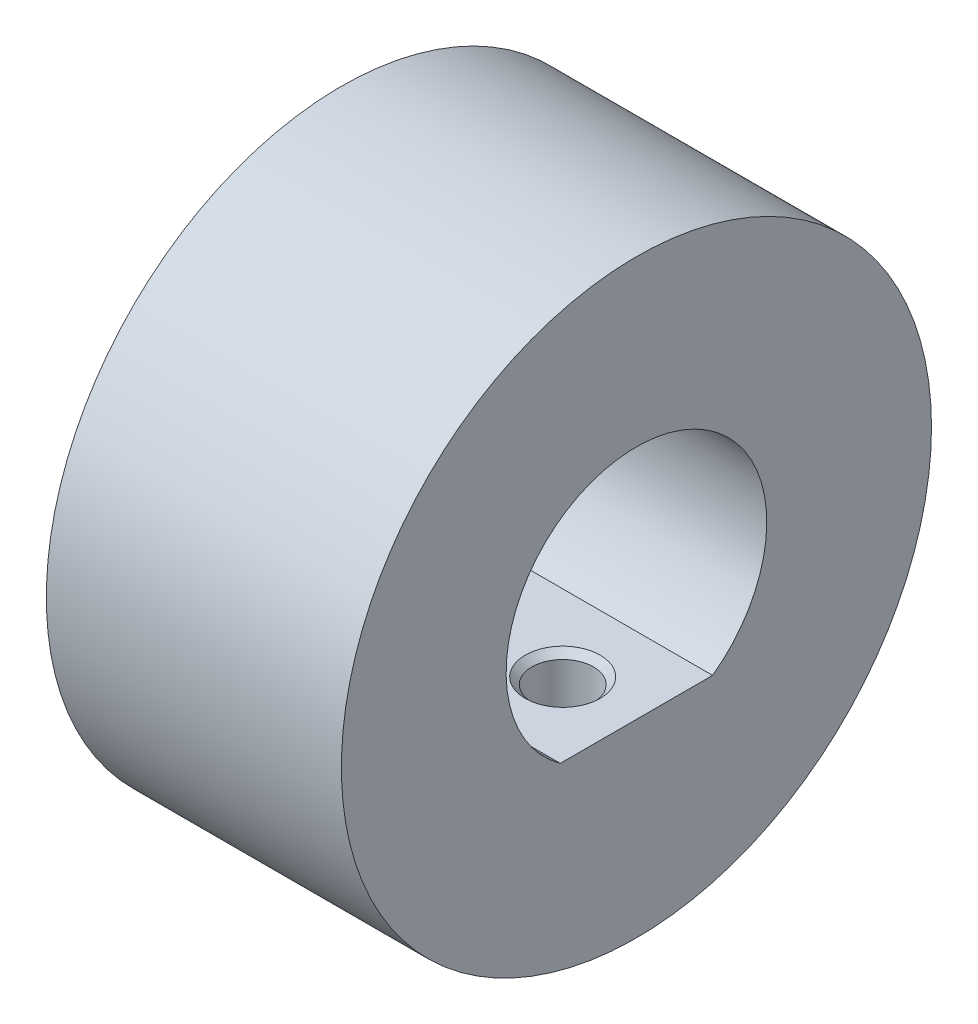
ISO-10303-21;
HEADER;
FILE_DESCRIPTION(('STEP AP214'),'2;1');
FILE_NAME('part.step','',(''),(''),'','','');
FILE_SCHEMA(('AUTOMOTIVE_DESIGN { 1 0 10303 214 1 1 1 1 }'));
ENDSEC;
DATA;
#1=APPLICATION_CONTEXT('core data for automotive mechanical design processes');
#2=APPLICATION_PROTOCOL_DEFINITION('international standard','automotive_design',2000,#1);
#3=PRODUCT_CONTEXT('',#1,'mechanical');
#4=PRODUCT('Part','Part','',(#3));
#5=PRODUCT_RELATED_PRODUCT_CATEGORY('part','',(#4));
#6=PRODUCT_DEFINITION_FORMATION('','',#4);
#7=PRODUCT_DEFINITION_CONTEXT('part definition',#1,'design');
#8=PRODUCT_DEFINITION('design','',#6,#7);
#9=PRODUCT_DEFINITION_SHAPE('','',#8);
#10=(LENGTH_UNIT() NAMED_UNIT(*) SI_UNIT(.MILLI.,.METRE.));
#11=(NAMED_UNIT(*) PLANE_ANGLE_UNIT() SI_UNIT($,.RADIAN.));
#12=(NAMED_UNIT(*) SI_UNIT($,.STERADIAN.) SOLID_ANGLE_UNIT());
#13=UNCERTAINTY_MEASURE_WITH_UNIT(LENGTH_MEASURE(1.E-05),#10,'distance_accuracy_value','');
#14=(GEOMETRIC_REPRESENTATION_CONTEXT(3) GLOBAL_UNCERTAINTY_ASSIGNED_CONTEXT((#13)) GLOBAL_UNIT_ASSIGNED_CONTEXT((#10,
#11,#12)) REPRESENTATION_CONTEXT('',''));
#15=CARTESIAN_POINT('',(0.,0.,0.));
#16=DIRECTION('',(0.,0.,1.));
#17=DIRECTION('',(1.,0.,0.));
#18=AXIS2_PLACEMENT_3D('',#15,#16,#17);
#19=CARTESIAN_POINT('',(21.41105965838,107.1240091412,98.74151472549));
#20=DIRECTION('',(-1.,0.,0.));
#21=DIRECTION('',(0.,0.,1.));
#22=AXIS2_PLACEMENT_3D('',#19,#20,#21);
#23=CONICAL_SURFACE('',#22,0.,1.02974425868897);
#24=CARTESIAN_POINT('',(21.41105965838,107.1240091412,98.74151472549));
#25=VERTEX_POINT('',#24);
#26=VERTEX_LOOP('',#25);
#27=FACE_BOUND('',#26,.T.);
#28=CARTESIAN_POINT('',(20.65998388459,107.1240091412,98.74151472549));
#29=DIRECTION('',(-1.,0.,0.));
#30=DIRECTION('',(0.,1.,0.));
#31=AXIS2_PLACEMENT_3D('',#28,#29,#30);
#32=CIRCLE('',#31,1.24999999999999);
#33=CARTESIAN_POINT('',(20.65998388459,108.3740091412,98.74151472549));
#34=VERTEX_POINT('',#33);
#35=EDGE_CURVE('E70',#34,#34,#32,.F.);
#36=ORIENTED_EDGE('',*,*,#35,.F.);
#37=EDGE_LOOP('',(#36));
#38=FACE_BOUND('',#37,.T.);
#39=ADVANCED_FACE('F16',(#27,#38),#23,.F.);
#40=CARTESIAN_POINT('',(21.41105965838,114.6190517522,91.51416149256));
#41=DIRECTION('',(-1.,0.,0.));
#42=DIRECTION('',(0.,0.,1.));
#43=AXIS2_PLACEMENT_3D('',#40,#41,#42);
#44=CONICAL_SURFACE('',#43,0.,1.02974425868897);
#45=CARTESIAN_POINT('',(21.41105965838,114.6190517522,91.51416149256));
#46=VERTEX_POINT('',#45);
#47=VERTEX_LOOP('',#46);
#48=FACE_BOUND('',#47,.T.);
#49=CARTESIAN_POINT('',(20.65998388459,114.6190517522,91.51416149256));
#50=DIRECTION('',(-1.,0.,0.));
#51=DIRECTION('',(0.,1.,0.));
#52=AXIS2_PLACEMENT_3D('',#49,#50,#51);
#53=CIRCLE('',#52,1.24999999999999);
#54=CARTESIAN_POINT('',(20.65998388459,115.8690517522,91.51416149256));
#55=VERTEX_POINT('',#54);
#56=EDGE_CURVE('E73',#55,#55,#53,.F.);
#57=ORIENTED_EDGE('',*,*,#56,.F.);
#58=EDGE_LOOP('',(#57));
#59=FACE_BOUND('',#58,.T.);
#60=ADVANCED_FACE('F66',(#48,#59),#44,.F.);
#61=CARTESIAN_POINT('',(21.41105965838,107.1240091412,83.74151472549));
#62=DIRECTION('',(-1.,0.,0.));
#63=DIRECTION('',(0.,0.,1.));
#64=AXIS2_PLACEMENT_3D('',#61,#62,#63);
#65=CONICAL_SURFACE('',#64,0.,1.02974425868897);
#66=CARTESIAN_POINT('',(21.41105965838,107.1240091412,83.74151472549));
#67=VERTEX_POINT('',#66);
#68=VERTEX_LOOP('',#67);
#69=FACE_BOUND('',#68,.T.);
#70=CARTESIAN_POINT('',(20.65998388459,107.1240091412,83.74151472549));
#71=DIRECTION('',(-1.,0.,0.));
#72=DIRECTION('',(0.,1.,0.));
#73=AXIS2_PLACEMENT_3D('',#70,#71,#72);
#74=CIRCLE('',#73,1.24999999999999);
#75=CARTESIAN_POINT('',(20.65998388459,108.3740091412,83.74151472549));
#76=VERTEX_POINT('',#75);
#77=EDGE_CURVE('E80',#76,#76,#74,.F.);
#78=ORIENTED_EDGE('',*,*,#77,.F.);
#79=EDGE_LOOP('',(#78));
#80=FACE_BOUND('',#79,.T.);
#81=ADVANCED_FACE('F200',(#69,#80),#65,.F.);
#82=CARTESIAN_POINT('',(20.65998388459,107.1240091412,98.74151472549));
#83=DIRECTION('',(-1.,0.,0.));
#84=DIRECTION('',(0.,0.,1.));
#85=AXIS2_PLACEMENT_3D('',#82,#83,#84);
#86=CYLINDRICAL_SURFACE('',#85,1.25);
#87=CARTESIAN_POINT('',(12.4349838845914,107.1240091412,98.74151472549));
#88=DIRECTION('',(-1.,0.,0.));
#89=DIRECTION('',(0.,1.,0.));
#90=AXIS2_PLACEMENT_3D('',#87,#88,#89);
#91=CIRCLE('',#90,1.25000000007321);
#92=CARTESIAN_POINT('',(12.4349838845914,108.374009141273,98.74151472549));
#93=VERTEX_POINT('',#92);
#94=EDGE_CURVE('E192',#93,#93,#91,.F.);
#95=ORIENTED_EDGE('',*,*,#94,.F.);
#96=EDGE_LOOP('',(#95));
#97=FACE_BOUND('',#96,.T.);
#98=ORIENTED_EDGE('',*,*,#35,.T.);
#99=EDGE_LOOP('',(#98));
#100=FACE_BOUND('',#99,.T.);
#101=ADVANCED_FACE('F202',(#97,#100),#86,.F.);
#102=CARTESIAN_POINT('',(20.65998388459,114.6190517522,91.51416149256));
#103=DIRECTION('',(-1.,0.,0.));
#104=DIRECTION('',(0.,0.,1.));
#105=AXIS2_PLACEMENT_3D('',#102,#103,#104);
#106=CYLINDRICAL_SURFACE('',#105,1.24999999999999);
#107=CARTESIAN_POINT('',(12.4349838845914,114.6190517522,91.51416149256));
#108=DIRECTION('',(-1.,0.,0.));
#109=DIRECTION('',(0.,1.,0.));
#110=AXIS2_PLACEMENT_3D('',#107,#108,#109);
#111=CIRCLE('',#110,1.24999999998229);
#112=CARTESIAN_POINT('',(12.4349838845914,115.869051752182,91.51416149256));
#113=VERTEX_POINT('',#112);
#114=EDGE_CURVE('E188',#113,#113,#111,.F.);
#115=ORIENTED_EDGE('',*,*,#114,.F.);
#116=EDGE_LOOP('',(#115));
#117=FACE_BOUND('',#116,.T.);
#118=ORIENTED_EDGE('',*,*,#56,.T.);
#119=EDGE_LOOP('',(#118));
#120=FACE_BOUND('',#119,.T.);
#121=ADVANCED_FACE('F207',(#117,#120),#106,.F.);
#122=CARTESIAN_POINT('',(20.65998388459,107.1240091412,83.74151472549));
#123=DIRECTION('',(-1.,0.,0.));
#124=DIRECTION('',(0.,0.,1.));
#125=AXIS2_PLACEMENT_3D('',#122,#123,#124);
#126=CYLINDRICAL_SURFACE('',#125,1.25);
#127=CARTESIAN_POINT('',(12.4349838845914,107.1240091412,83.74151472549));
#128=DIRECTION('',(-1.,0.,0.));
#129=DIRECTION('',(0.,1.,0.));
#130=AXIS2_PLACEMENT_3D('',#127,#128,#129);
#131=CIRCLE('',#130,1.25000000007321);
#132=CARTESIAN_POINT('',(12.4349838845914,108.374009141273,83.74151472549));
#133=VERTEX_POINT('',#132);
#134=EDGE_CURVE('E185',#133,#133,#131,.F.);
#135=ORIENTED_EDGE('',*,*,#134,.F.);
#136=EDGE_LOOP('',(#135));
#137=FACE_BOUND('',#136,.T.);
#138=ORIENTED_EDGE('',*,*,#77,.T.);
#139=EDGE_LOOP('',(#138));
#140=FACE_BOUND('',#139,.T.);
#141=ADVANCED_FACE('F149',(#137,#140),#126,.F.);
#142=CARTESIAN_POINT('',(12.15998388459,107.1240091412,91.24151472549));
#143=DIRECTION('',(1.,0.,0.));
#144=DIRECTION('',(0.,0.,-1.));
#145=AXIS2_PLACEMENT_3D('',#142,#143,#144);
#146=CYLINDRICAL_SURFACE('',#145,11.99999999996);
#147=CARTESIAN_POINT('',(13.90998388459,95.12400914124,91.2415149440293));
#148=CARTESIAN_POINT('',(13.9099868771111,95.1240099708754,91.1715046838228));
#149=CARTESIAN_POINT('',(13.9158853291396,95.1246283156418,91.1014490841306));
#150=CARTESIAN_POINT('',(13.9393256126678,95.1270355305798,90.9632816715167));
#151=CARTESIAN_POINT('',(13.9568800432397,95.1288256673243,90.8951720452007));
#152=CARTESIAN_POINT('',(14.0031151008883,95.1333744972015,90.7629154606143));
#153=CARTESIAN_POINT('',(14.0317891258246,95.1361326155132,90.6987661770827));
#154=CARTESIAN_POINT('',(14.0994349359428,95.1423091372306,90.5762065769242));
#155=CARTESIAN_POINT('',(14.1384043944056,95.1457273914017,90.5177949676966));
#156=CARTESIAN_POINT('',(14.2256930699479,95.1528560613593,90.4081309524338));
#157=CARTESIAN_POINT('',(14.2740433056393,95.1565674215029,90.3569032968082));
#158=CARTESIAN_POINT('',(14.3786693793685,95.1638571766945,90.2632626368071));
#159=CARTESIAN_POINT('',(14.4349473328647,95.1674355359291,90.2208519926952));
#160=CARTESIAN_POINT('',(14.5540009596617,95.1740645384081,90.145957431993));
#161=CARTESIAN_POINT('',(14.6167940305565,95.1771137073996,90.1135010598827));
#162=CARTESIAN_POINT('',(14.7469317554394,95.1823215544009,90.0596363400773));
#163=CARTESIAN_POINT('',(14.8142712618742,95.1844812204762,90.0382157271177));
#164=CARTESIAN_POINT('',(14.9283131354627,95.1871293660268,90.0122862183268));
#165=CARTESIAN_POINT('',(14.9742913501161,95.1879360315886,90.0045077179527));
#166=CARTESIAN_POINT('',(15.0668343146717,95.1890170688366,89.994120984191));
#167=CARTESIAN_POINT('',(15.1133990616928,95.1892914431365,89.9915127254153));
#168=CARTESIAN_POINT('',(15.2299929838874,95.1892900310988,89.9915177312636));
#169=CARTESIAN_POINT('',(15.3000474245496,95.1886682347059,89.9974160064895));
#170=CARTESIAN_POINT('',(15.4382124266851,95.1862486932552,90.0208554947713));
#171=CARTESIAN_POINT('',(15.5063208006626,95.1844496753133,90.0384093108142));
#172=CARTESIAN_POINT('',(15.6385747358017,95.1798815839907,90.0846425591975));
#173=CARTESIAN_POINT('',(15.7027226327746,95.1771130889434,90.1133153596957));
#174=CARTESIAN_POINT('',(15.8252799054927,95.1709188335472,90.180958281123));
#175=CARTESIAN_POINT('',(15.8836905721328,95.1674932215662,90.2199260783308));
#176=CARTESIAN_POINT('',(15.9933556261628,95.1603558900254,90.3072130838108));
#177=CARTESIAN_POINT('',(16.0445849672968,95.1566432359194,90.3555636841417));
#178=CARTESIAN_POINT('',(16.1382288795551,95.1493576815488,90.460191197091));
#179=CARTESIAN_POINT('',(16.1806410955724,95.1457848188296,90.5164702207217));
#180=CARTESIAN_POINT('',(16.2555372889438,95.1391713192963,90.6355247913496));
#181=CARTESIAN_POINT('',(16.2879940125714,95.1361321530479,90.6983175529867));
#182=CARTESIAN_POINT('',(16.3418594698281,95.1309442790815,90.8284546054125));
#183=CARTESIAN_POINT('',(16.3632804630368,95.1287945837765,90.8957937511217));
#184=CARTESIAN_POINT('',(16.3892110740728,95.1261593267742,91.0098366618714));
#185=CARTESIAN_POINT('',(16.3969900746961,95.1253568293126,91.0558163657439));
#186=CARTESIAN_POINT('',(16.4073774693265,95.1242814611489,91.1483623029848));
#187=CARTESIAN_POINT('',(16.4099858882485,95.1240085878948,91.194928533526));
#188=CARTESIAN_POINT('',(16.4099808734764,95.1240099728115,91.3115250995491));
#189=CARTESIAN_POINT('',(16.4040824027854,95.1246283195222,91.3815806979184));
#190=CARTESIAN_POINT('',(16.3806420823959,95.1270355381388,91.5197481046302));
#191=CARTESIAN_POINT('',(16.3630876336544,95.1288256766144,91.5878577263684));
#192=CARTESIAN_POINT('',(16.3168525406769,95.1333745095475,91.7201142988627));
#193=CARTESIAN_POINT('',(16.2881784985706,95.1361326291853,91.7842635748782));
#194=CARTESIAN_POINT('',(16.2205326555773,95.1423091530021,91.9068231572762));
#195=CARTESIAN_POINT('',(16.1815631814045,95.145727407947,91.9652347562575));
#196=CARTESIAN_POINT('',(16.0942744762685,95.1528560788146,92.0748987485264));
#197=CARTESIAN_POINT('',(16.0459242266969,95.1565674390921,92.1261263913937));
#198=CARTESIAN_POINT('',(15.9412981274557,95.1638571938891,92.2197670237324));
#199=CARTESIAN_POINT('',(15.8850201623249,95.1674355525949,92.262177652936));
#200=CARTESIAN_POINT('',(15.7659665150711,95.1740645533906,92.3370721818606));
#201=CARTESIAN_POINT('',(15.7031734353837,95.1771137212278,92.3695285371319));
#202=CARTESIAN_POINT('',(15.5730356959808,95.1823215654308,92.4233932219475));
#203=CARTESIAN_POINT('',(15.5056961838271,95.1844812298648,92.4448138167855));
#204=CARTESIAN_POINT('',(15.3916543579919,95.1871293711815,92.4707432824989));
#205=CARTESIAN_POINT('',(15.3456761972151,95.1879360348271,92.4785217642227));
#206=CARTESIAN_POINT('',(15.2531333425268,95.1890170694977,92.4889084730617));
#207=CARTESIAN_POINT('',(15.2065686514966,95.1892914431365,92.4915167255647));
#208=CARTESIAN_POINT('',(15.0899747854447,95.1892900310979,92.4915117197128));
#209=CARTESIAN_POINT('',(15.0199203448252,95.1886682347073,92.4856134445046));
#210=CARTESIAN_POINT('',(14.8817553426506,95.18624869326,92.4621739562541));
#211=CARTESIAN_POINT('',(14.8136469685966,95.1844496753162,92.4446201401952));
#212=CARTESIAN_POINT('',(14.6813930333611,95.1798815839899,92.3983868917747));
#213=CARTESIAN_POINT('',(14.6172451363646,95.1771130889416,92.3697140912655));
#214=CARTESIAN_POINT('',(14.4946878636479,95.1709188335449,92.3020711698315));
#215=CARTESIAN_POINT('',(14.4362771970289,95.1674932215651,92.2631033726346));
#216=CARTESIAN_POINT('',(14.3266121430354,95.1603558900266,92.1758163671837));
#217=CARTESIAN_POINT('',(14.2753828019168,95.1566432359218,92.1274657668709));
#218=CARTESIAN_POINT('',(14.1817388896522,95.1493576815511,92.0228382539244));
#219=CARTESIAN_POINT('',(14.139326673619,95.1457848188306,91.9665592302732));
#220=CARTESIAN_POINT('',(14.0644304801896,95.1391713192922,91.8475046595594));
#221=CARTESIAN_POINT('',(14.0319737565293,95.1361321530403,91.7847118978509));
#222=CARTESIAN_POINT('',(13.9781082992947,95.1309442790759,91.65457484538));
#223=CARTESIAN_POINT('',(13.9566873061129,95.128794583774,91.5872356997088));
#224=CARTESIAN_POINT('',(13.930756707371,95.1261593280201,91.4731928430557));
#225=CARTESIAN_POINT('',(13.9229777129723,95.1253568312187,91.4272131945171));
#226=CARTESIAN_POINT('',(13.912590318397,95.1242814630765,91.3346673686467));
#227=CARTESIAN_POINT('',(13.9099818933057,95.1240085891838,91.2881011941421));
#228=CARTESIAN_POINT('',(13.90998388459,95.12400914124,91.2415149440293));
#229=B_SPLINE_CURVE_WITH_KNOTS('',3,(#147,#148,#149,#150,#151,#152,#153,#154,#155,#156,#157,
#158,#159,#160,#161,#162,#163,#164,#165,#166,#167,#168,#169,#170,#171,#172,#173,#174,#175,#176,
#177,#178,#179,#180,#181,#182,#183,#184,#185,#186,#187,#188,#189,#190,#191,#192,#193,#194,#195,
#196,#197,#198,#199,#200,#201,#202,#203,#204,#205,#206,#207,#208,#209,#210,#211,#212,#213,#214,
#215,#216,#217,#218,#219,#220,#221,#222,#223,#224,#225,#226,#227,#228),.UNSPECIFIED.,.T.,.F.,(4,
2,2,2,2,2,2,2,2,2,2,2,2,2,2,2,2,2,2,2,2,2,2,2,2,2,2,2,2,2,2,2,2,2,2,2,2,2,2,2,4),(0.,
0.209860726569951,0.419948663926892,0.629912054324562,0.839828034522708,1.05045033427337,
1.26112894401399,1.47238536983435,1.68340649365341,1.8230484884523,1.96268979755019,
2.17254703573987,2.38263156020724,2.5925909734469,2.80250303641199,3.01312990303693,
3.2238129572805,3.43506772417936,3.64608729959737,3.78573373116367,3.92537948982874,
4.13524021731723,4.3453281550795,4.55529154607663,4.76520752696661,4.97582982747718,
5.18650843806743,5.3977648640012,5.60878598739771,5.74842781448279,5.8880689558722,
6.09792619379626,6.30801071852925,6.51797013183722,6.72788219473399,6.9385090612906,
7.14919211560251,7.36044688276792,7.57146645791935,7.71111272373324,7.85075831665094),.UNSPECIFIED.);
#230=CARTESIAN_POINT('',(13.90998388459,95.12400914124,91.2415149440293));
#231=VERTEX_POINT('',#230);
#232=EDGE_CURVE('E112',#231,#231,#229,.T.);
#233=ORIENTED_EDGE('',*,*,#232,.F.);
#234=EDGE_LOOP('',(#233));
#235=FACE_BOUND('',#234,.T.);
#236=CARTESIAN_POINT('',(19.9099838845646,95.1240091412146,91.2415149440293));
#237=CARTESIAN_POINT('',(19.9099868770803,95.1240099708446,91.1715046838243));
#238=CARTESIAN_POINT('',(19.915885329131,95.1246283156335,91.1014490841336));
#239=CARTESIAN_POINT('',(19.9393256126754,95.127035530588,90.9632816715197));
#240=CARTESIAN_POINT('',(19.9568800432414,95.1288256673265,90.8951720452022));
#241=CARTESIAN_POINT('',(20.0031151008861,95.1333744971993,90.7629154606141));
#242=CARTESIAN_POINT('',(20.0317891258243,95.1361326155127,90.6987661770821));
#243=CARTESIAN_POINT('',(20.0994349359437,95.1423091372312,90.5762065769238));
#244=CARTESIAN_POINT('',(20.1384043944058,95.1457273914019,90.5177949676967));
#245=CARTESIAN_POINT('',(20.2256930699471,95.1528560613591,90.4081309524345));
#246=CARTESIAN_POINT('',(20.2740433056384,95.1565674215028,90.356903296809));
#247=CARTESIAN_POINT('',(20.3786693793676,95.1638571766945,90.2632626368079));
#248=CARTESIAN_POINT('',(20.4349473328639,95.167435535929,90.2208519926958));
#249=CARTESIAN_POINT('',(20.5540009596611,95.174064538408,90.1459574319933));
#250=CARTESIAN_POINT('',(20.6167940305559,95.1771137073995,90.113501059883));
#251=CARTESIAN_POINT('',(20.7469317554388,95.1823215544009,90.0596363400775));
#252=CARTESIAN_POINT('',(20.8142712618736,95.1844812204762,90.0382157271179));
#253=CARTESIAN_POINT('',(20.9283131354621,95.1871293660267,90.0122862183269));
#254=CARTESIAN_POINT('',(20.9742913501156,95.1879360315886,90.0045077179528));
#255=CARTESIAN_POINT('',(21.0668343146715,95.1890170688366,89.994120984191));
#256=CARTESIAN_POINT('',(21.1133990616926,95.1892914431365,89.9915127254153));
#257=CARTESIAN_POINT('',(21.2299929838874,95.1892900310988,89.9915177312635));
#258=CARTESIAN_POINT('',(21.3000474245496,95.1886682347059,89.9974160064895));
#259=CARTESIAN_POINT('',(21.4382124266852,95.1862486932552,90.0208554947713));
#260=CARTESIAN_POINT('',(21.5063208006626,95.1844496753133,90.0384093108142));
#261=CARTESIAN_POINT('',(21.6385747358017,95.1798815839907,90.0846425591975));
#262=CARTESIAN_POINT('',(21.7027226327747,95.1771130889434,90.1133153596957));
#263=CARTESIAN_POINT('',(21.8252799054927,95.1709188335472,90.180958281123));
#264=CARTESIAN_POINT('',(21.8836905721328,95.1674932215662,90.2199260783308));
#265=CARTESIAN_POINT('',(21.9933556261628,95.1603558900254,90.3072130838108));
#266=CARTESIAN_POINT('',(22.0445849672968,95.1566432359194,90.3555636841417));
#267=CARTESIAN_POINT('',(22.1382288795551,95.1493576815488,90.460191197091));
#268=CARTESIAN_POINT('',(22.1806410955724,95.1457848188296,90.5164702207217));
#269=CARTESIAN_POINT('',(22.2555372889438,95.1391713192963,90.6355247913496));
#270=CARTESIAN_POINT('',(22.2879940125714,95.1361321530479,90.6983175529867));
#271=CARTESIAN_POINT('',(22.3418594698281,95.1309442790815,90.8284546054125));
#272=CARTESIAN_POINT('',(22.3632804630368,95.1287945837765,90.8957937511217));
#273=CARTESIAN_POINT('',(22.3892110740727,95.1261593267742,91.0098366618707));
#274=CARTESIAN_POINT('',(22.3969900746959,95.1253568293126,91.0558163657423));
#275=CARTESIAN_POINT('',(22.4073774693262,95.1242814611489,91.1483623029818));
#276=CARTESIAN_POINT('',(22.4099858882483,95.1240085878948,91.1949285335222));
#277=CARTESIAN_POINT('',(22.4099808734767,95.1240099728114,91.3115250995452));
#278=CARTESIAN_POINT('',(22.4040824027858,95.1246283195221,91.3815806979153));
#279=CARTESIAN_POINT('',(22.3806420823964,95.1270355381388,91.5197481046284));
#280=CARTESIAN_POINT('',(22.3630876336547,95.1288256766144,91.5878577263674));
#281=CARTESIAN_POINT('',(22.3168525406771,95.1333745095475,91.7201142988623));
#282=CARTESIAN_POINT('',(22.2881784985709,95.1361326291853,91.7842635748778));
#283=CARTESIAN_POINT('',(22.2205326555776,95.1423091530021,91.9068231572757));
#284=CARTESIAN_POINT('',(22.1815631814049,95.145727407947,91.9652347562569));
#285=CARTESIAN_POINT('',(22.094274476269,95.1528560788146,92.0748987485258));
#286=CARTESIAN_POINT('',(22.0459242266975,95.156567439092,92.1261263913931));
#287=CARTESIAN_POINT('',(21.9412981274563,95.1638571938891,92.2197670237319));
#288=CARTESIAN_POINT('',(21.8850201623255,95.1674355525949,92.2621776529356));
#289=CARTESIAN_POINT('',(21.7659665150718,95.1740645533906,92.3370721818602));
#290=CARTESIAN_POINT('',(21.7031734353843,95.1771137212278,92.3695285371316));
#291=CARTESIAN_POINT('',(21.5730356959815,95.1823215654308,92.4233932219472));
#292=CARTESIAN_POINT('',(21.5056961838278,95.1844812298648,92.4448138167853));
#293=CARTESIAN_POINT('',(21.3916543579925,95.1871293711815,92.4707432824987));
#294=CARTESIAN_POINT('',(21.3456761972156,95.1879360348271,92.4785217642226));
#295=CARTESIAN_POINT('',(21.2531333425271,95.1890170694977,92.4889084730617));
#296=CARTESIAN_POINT('',(21.2065686514968,95.1892914431365,92.4915167255647));
#297=CARTESIAN_POINT('',(21.0899747854447,95.1892900310978,92.4915117197128));
#298=CARTESIAN_POINT('',(21.0199203448252,95.1886682347073,92.4856134445046));
#299=CARTESIAN_POINT('',(20.8817553426505,95.1862486932599,92.462173956254));
#300=CARTESIAN_POINT('',(20.8136469685965,95.1844496753162,92.4446201401952));
#301=CARTESIAN_POINT('',(20.6813930333612,95.1798815839899,92.3983868917747));
#302=CARTESIAN_POINT('',(20.6172451363648,95.1771130889416,92.3697140912656));
#303=CARTESIAN_POINT('',(20.494687863648,95.170918833545,92.3020711698316));
#304=CARTESIAN_POINT('',(20.436277197029,95.1674932215651,92.2631033726346));
#305=CARTESIAN_POINT('',(20.3266121430352,95.1603558900266,92.1758163671835));
#306=CARTESIAN_POINT('',(20.2753828019164,95.1566432359219,92.1274657668705));
#307=CARTESIAN_POINT('',(20.1817388896518,95.149357681551,92.0228382539239));
#308=CARTESIAN_POINT('',(20.1393266736187,95.1457848188304,91.966559230273));
#309=CARTESIAN_POINT('',(20.0644304801901,95.1391713192924,91.8475046595599));
#310=CARTESIAN_POINT('',(20.0319737565306,95.1361321530412,91.7847118978519));
#311=CARTESIAN_POINT('',(19.9781082992942,95.1309442790752,91.6545748453812));
#312=CARTESIAN_POINT('',(19.9566873061102,95.1287945837711,91.5872356997095));
#313=CARTESIAN_POINT('',(19.9307567073728,95.126159328022,91.4731928430549));
#314=CARTESIAN_POINT('',(19.922977712978,95.1253568312246,91.4272131945155));
#315=CARTESIAN_POINT('',(19.9125903183909,95.1242814630705,91.3346673686451));
#316=CARTESIAN_POINT('',(19.9099818932838,95.1240085891619,91.2881011941413));
#317=CARTESIAN_POINT('',(19.9099838845646,95.1240091412146,91.2415149440293));
#318=B_SPLINE_CURVE_WITH_KNOTS('',3,(#236,#237,#238,#239,#240,#241,#242,#243,#244,#245,#246,
#247,#248,#249,#250,#251,#252,#253,#254,#255,#256,#257,#258,#259,#260,#261,#262,#263,#264,#265,
#266,#267,#268,#269,#270,#271,#272,#273,#274,#275,#276,#277,#278,#279,#280,#281,#282,#283,#284,
#285,#286,#287,#288,#289,#290,#291,#292,#293,#294,#295,#296,#297,#298,#299,#300,#301,#302,#303,
#304,#305,#306,#307,#308,#309,#310,#311,#312,#313,#314,#315,#316,#317),.UNSPECIFIED.,.T.,.F.,(4,
2,2,2,2,2,2,2,2,2,2,2,2,2,2,2,2,2,2,2,2,2,2,2,2,2,2,2,2,2,2,2,2,2,2,2,2,2,2,2,4),(0.,
0.209860726568466,0.419948663928883,0.629912054328058,0.839828034524341,1.05045033427429,
1.26112894401562,1.47238536983623,1.68340649365504,1.82304848845426,1.96268979755256,
2.17254703574225,2.3826315602096,2.59259097344927,2.80250303641435,3.01312990303932,
3.22381295728286,3.4350677241817,3.64608729959973,3.78573373116377,3.92537948982655,
4.13524021731712,4.34532815508147,4.55529154607844,4.76520752696821,4.97582982747878,
5.18650843806903,5.39776486400281,5.60878598739931,5.74842781448475,5.88806895587455,
6.09792619379871,6.3080107185316,6.51797013183926,6.72788219473635,6.93850906129383,
7.14919211560487,7.36044688276854,7.57146645792171,7.71111272373758,7.85075831665487),.UNSPECIFIED.);
#319=CARTESIAN_POINT('',(19.9099838845646,95.1240091412146,91.2415149440293));
#320=VERTEX_POINT('',#319);
#321=EDGE_CURVE('E20',#320,#320,#318,.T.);
#322=ORIENTED_EDGE('',*,*,#321,.F.);
#323=EDGE_LOOP('',(#322));
#324=FACE_BOUND('',#323,.T.);
#325=CARTESIAN_POINT('',(24.1599838845896,107.1240091412,91.24151472549));
#326=DIRECTION('',(1.,0.,0.));
#327=DIRECTION('',(0.,0.,-1.));
#328=AXIS2_PLACEMENT_3D('',#325,#326,#327);
#329=CIRCLE('',#328,11.99999999996);
#330=CARTESIAN_POINT('',(24.1599838845896,107.1240091412,79.24151472553));
#331=VERTEX_POINT('',#330);
#332=EDGE_CURVE('E109',#331,#331,#329,.F.);
#333=ORIENTED_EDGE('',*,*,#332,.T.);
#334=EDGE_LOOP('',(#333));
#335=FACE_BOUND('',#334,.T.);
#336=CARTESIAN_POINT('',(12.15998388459,107.1240091412,91.24151472549));
#337=DIRECTION('',(1.,0.,0.));
#338=DIRECTION('',(0.,0.,-1.));
#339=AXIS2_PLACEMENT_3D('',#336,#337,#338);
#340=CIRCLE('',#339,11.99999999996);
#341=CARTESIAN_POINT('',(12.15998388459,107.1240091412,79.24151472553));
#342=VERTEX_POINT('',#341);
#343=EDGE_CURVE('E105',#342,#342,#340,.F.);
#344=ORIENTED_EDGE('',*,*,#343,.F.);
#345=EDGE_LOOP('',(#344));
#346=FACE_BOUND('',#345,.T.);
#347=ADVANCED_FACE('F119',(#235,#324,#335,#346),#146,.T.);
#348=CARTESIAN_POINT('',(12.4349838845914,107.1240091412,98.74151472549));
#349=DIRECTION('',(-1.,0.,0.));
#350=DIRECTION('',(0.,0.,1.));
#351=AXIS2_PLACEMENT_3D('',#348,#349,#350);
#352=CONICAL_SURFACE('',#351,1.25000000007319,0.785398163308192);
#353=CARTESIAN_POINT('',(12.1599838845887,107.1240091412,98.74151472549));
#354=DIRECTION('',(-1.,0.,0.));
#355=DIRECTION('',(0.,0.,1.));
#356=AXIS2_PLACEMENT_3D('',#353,#354,#355);
#357=CIRCLE('',#356,1.5250000000268);
#358=CARTESIAN_POINT('',(12.1599838845887,107.1240091412,100.266514725517));
#359=VERTEX_POINT('',#358);
#360=EDGE_CURVE('E101',#359,#359,#357,.F.);
#361=ORIENTED_EDGE('',*,*,#360,.F.);
#362=EDGE_LOOP('',(#361));
#363=FACE_BOUND('',#362,.T.);
#364=ORIENTED_EDGE('',*,*,#94,.T.);
#365=EDGE_LOOP('',(#364));
#366=FACE_BOUND('',#365,.T.);
#367=ADVANCED_FACE('F142',(#363,#366),#352,.F.);
#368=CARTESIAN_POINT('',(12.4349838845914,114.6190517522,91.51416149256));
#369=DIRECTION('',(-1.,0.,0.));
#370=DIRECTION('',(0.,0.,1.));
#371=AXIS2_PLACEMENT_3D('',#368,#369,#370);
#372=CONICAL_SURFACE('',#371,1.24999999998231,0.785398163456934);
#373=CARTESIAN_POINT('',(12.1599838845887,114.6190517522,91.51416149256));
#374=DIRECTION('',(-1.,0.,0.));
#375=DIRECTION('',(0.,0.,1.));
#376=AXIS2_PLACEMENT_3D('',#373,#374,#375);
#377=CIRCLE('',#376,1.52500000001772);
#378=CARTESIAN_POINT('',(12.1599838845887,114.6190517522,93.0391614925777));
#379=VERTEX_POINT('',#378);
#380=EDGE_CURVE('E97',#379,#379,#377,.F.);
#381=ORIENTED_EDGE('',*,*,#380,.F.);
#382=EDGE_LOOP('',(#381));
#383=FACE_BOUND('',#382,.T.);
#384=ORIENTED_EDGE('',*,*,#114,.T.);
#385=EDGE_LOOP('',(#384));
#386=FACE_BOUND('',#385,.T.);
#387=ADVANCED_FACE('F139',(#383,#386),#372,.F.);
#388=CARTESIAN_POINT('',(12.4349838845914,107.1240091412,83.74151472549));
#389=DIRECTION('',(-1.,0.,0.));
#390=DIRECTION('',(0.,0.,1.));
#391=AXIS2_PLACEMENT_3D('',#388,#389,#390);
#392=CONICAL_SURFACE('',#391,1.25000000007319,0.785398163308192);
#393=CARTESIAN_POINT('',(12.1599838845887,107.1240091412,83.74151472549));
#394=DIRECTION('',(-1.,0.,0.));
#395=DIRECTION('',(0.,0.,1.));
#396=AXIS2_PLACEMENT_3D('',#393,#394,#395);
#397=CIRCLE('',#396,1.5250000000268);
#398=CARTESIAN_POINT('',(12.1599838845887,107.1240091412,85.2665147255168));
#399=VERTEX_POINT('',#398);
#400=EDGE_CURVE('E93',#399,#399,#397,.F.);
#401=ORIENTED_EDGE('',*,*,#400,.F.);
#402=EDGE_LOOP('',(#401));
#403=FACE_BOUND('',#402,.T.);
#404=ORIENTED_EDGE('',*,*,#134,.T.);
#405=EDGE_LOOP('',(#404));
#406=FACE_BOUND('',#405,.T.);
#407=ADVANCED_FACE('F135',(#403,#406),#392,.F.);
#408=CARTESIAN_POINT('',(21.15998388459,95.0793857677899,91.24151472549));
#409=DIRECTION('',(0.,1.,0.));
#410=DIRECTION('',(-1.,0.,0.));
#411=AXIS2_PLACEMENT_3D('',#408,#409,#410);
#412=CYLINDRICAL_SURFACE('',#411,1.24999999999999);
#413=CARTESIAN_POINT('',(21.15998388459,102.549009141273,91.24151472549));
#414=DIRECTION('',(0.,1.,0.));
#415=DIRECTION('',(0.,0.,-1.));
#416=AXIS2_PLACEMENT_3D('',#413,#414,#415);
#417=CIRCLE('',#416,1.24999999999864);
#418=CARTESIAN_POINT('',(21.15998388459,102.549009141273,89.9915147254914));
#419=VERTEX_POINT('',#418);
#420=EDGE_CURVE('E90',#419,#419,#417,.F.);
#421=ORIENTED_EDGE('',*,*,#420,.F.);
#422=EDGE_LOOP('',(#421));
#423=FACE_BOUND('',#422,.T.);
#424=ORIENTED_EDGE('',*,*,#321,.T.);
#425=EDGE_LOOP('',(#424));
#426=FACE_BOUND('',#425,.T.);
#427=ADVANCED_FACE('F128',(#423,#426),#412,.F.);
#428=CARTESIAN_POINT('',(15.15998388459,95.0793857677899,91.24151472549));
#429=DIRECTION('',(0.,1.,0.));
#430=DIRECTION('',(-1.,0.,0.));
#431=AXIS2_PLACEMENT_3D('',#428,#429,#430);
#432=CYLINDRICAL_SURFACE('',#431,1.24999999999999);
#433=CARTESIAN_POINT('',(15.15998388459,102.549009141273,91.24151472549));
#434=DIRECTION('',(0.,1.,0.));
#435=DIRECTION('',(0.,0.,-1.));
#436=AXIS2_PLACEMENT_3D('',#433,#434,#435);
#437=CIRCLE('',#436,1.24999999999864);
#438=CARTESIAN_POINT('',(15.15998388459,102.549009141273,89.9915147254914));
#439=VERTEX_POINT('',#438);
#440=EDGE_CURVE('E178',#439,#439,#437,.F.);
#441=ORIENTED_EDGE('',*,*,#440,.F.);
#442=EDGE_LOOP('',(#441));
#443=FACE_BOUND('',#442,.T.);
#444=ORIENTED_EDGE('',*,*,#232,.T.);
#445=EDGE_LOOP('',(#444));
#446=FACE_BOUND('',#445,.T.);
#447=ADVANCED_FACE('F123',(#443,#446),#432,.F.);
#448=CARTESIAN_POINT('',(24.15998388459,94.64400914124,103.7300733518));
#449=DIRECTION('',(-1.,0.,0.));
#450=DIRECTION('',(0.,1.,0.));
#451=AXIS2_PLACEMENT_3D('',#448,#449,#450);
#452=PLANE('',#451);
#453=CARTESIAN_POINT('',(24.1599838845896,107.1240091412,91.24151472549));
#454=DIRECTION('',(1.,0.,0.));
#455=DIRECTION('',(0.,0.,-1.));
#456=AXIS2_PLACEMENT_3D('',#453,#454,#455);
#457=CIRCLE('',#456,5.29999999999999);
#458=CARTESIAN_POINT('',(24.1599838845898,102.8240091412,88.1431280485215));
#459=VERTEX_POINT('',#458);
#460=CARTESIAN_POINT('',(24.1599838845898,102.8240091412,94.3399014024537));
#461=VERTEX_POINT('',#460);
#462=EDGE_CURVE('E51',#459,#461,#457,.T.);
#463=ORIENTED_EDGE('',*,*,#462,.F.);
#464=DIRECTION('',(0.,0.,-1.));
#465=VECTOR('',#464,1.);
#466=CARTESIAN_POINT('',(24.15998388459,102.8240091412,91.241514725485));
#467=LINE('',#466,#465);
#468=EDGE_CURVE('E55',#461,#459,#467,.T.);
#469=ORIENTED_EDGE('',*,*,#468,.F.);
#470=EDGE_LOOP('',(#463,#469));
#471=FACE_BOUND('',#470,.T.);
#472=ORIENTED_EDGE('',*,*,#332,.F.);
#473=EDGE_LOOP('',(#472));
#474=FACE_BOUND('',#473,.T.);
#475=ADVANCED_FACE('F127',(#471,#474),#452,.F.);
#476=CARTESIAN_POINT('',(12.15998388459,94.64400914124,103.7300733518));
#477=DIRECTION('',(-1.,0.,0.));
#478=DIRECTION('',(0.,1.,0.));
#479=AXIS2_PLACEMENT_3D('',#476,#477,#478);
#480=PLANE('',#479);
#481=DIRECTION('',(0.,0.,1.));
#482=VECTOR('',#481,1.);
#483=CARTESIAN_POINT('',(12.15998388459,102.8240091412,91.241514725485));
#484=LINE('',#483,#482);
#485=CARTESIAN_POINT('',(12.15998388459,102.8240091412,88.1431280485215));
#486=VERTEX_POINT('',#485);
#487=CARTESIAN_POINT('',(12.15998388459,102.8240091412,94.3399014024537));
#488=VERTEX_POINT('',#487);
#489=EDGE_CURVE('E168',#486,#488,#484,.T.);
#490=ORIENTED_EDGE('',*,*,#489,.F.);
#491=CARTESIAN_POINT('',(12.15998388459,107.1240091412,91.24151472549));
#492=DIRECTION('',(1.,0.,0.));
#493=DIRECTION('',(0.,0.,-1.));
#494=AXIS2_PLACEMENT_3D('',#491,#492,#493);
#495=CIRCLE('',#494,5.29999999999999);
#496=EDGE_CURVE('E40',#488,#486,#495,.F.);
#497=ORIENTED_EDGE('',*,*,#496,.F.);
#498=EDGE_LOOP('',(#490,#497));
#499=FACE_BOUND('',#498,.T.);
#500=ORIENTED_EDGE('',*,*,#400,.T.);
#501=EDGE_LOOP('',(#500));
#502=FACE_BOUND('',#501,.T.);
#503=ORIENTED_EDGE('',*,*,#380,.T.);
#504=EDGE_LOOP('',(#503));
#505=FACE_BOUND('',#504,.T.);
#506=ORIENTED_EDGE('',*,*,#360,.T.);
#507=EDGE_LOOP('',(#506));
#508=FACE_BOUND('',#507,.T.);
#509=ORIENTED_EDGE('',*,*,#343,.T.);
#510=EDGE_LOOP('',(#509));
#511=FACE_BOUND('',#510,.T.);
#512=ADVANCED_FACE('F214',(#499,#502,#505,#508,#511),#480,.T.);
#513=CARTESIAN_POINT('',(12.15998388459,107.1240091412,91.24151472549));
#514=DIRECTION('',(1.,0.,0.));
#515=DIRECTION('',(0.,0.,-1.));
#516=AXIS2_PLACEMENT_3D('',#513,#514,#515);
#517=CYLINDRICAL_SURFACE('',#516,5.29999999999999);
#518=ORIENTED_EDGE('',*,*,#496,.T.);
#519=DIRECTION('',(-1.,0.,0.));
#520=VECTOR('',#519,1.);
#521=CARTESIAN_POINT('',(18.15998388459,102.8240091412,88.143128048519));
#522=LINE('',#521,#520);
#523=EDGE_CURVE('E169',#459,#486,#522,.T.);
#524=ORIENTED_EDGE('',*,*,#523,.F.);
#525=ORIENTED_EDGE('',*,*,#462,.T.);
#526=DIRECTION('',(1.,0.,0.));
#527=VECTOR('',#526,1.);
#528=CARTESIAN_POINT('',(18.15998388459,102.8240091412,94.3399014024514));
#529=LINE('',#528,#527);
#530=EDGE_CURVE('E87',#488,#461,#529,.T.);
#531=ORIENTED_EDGE('',*,*,#530,.F.);
#532=EDGE_LOOP('',(#518,#524,#525,#531));
#533=FACE_BOUND('',#532,.T.);
#534=ADVANCED_FACE('F130',(#533),#517,.F.);
#535=CARTESIAN_POINT('',(21.15998388459,102.549009141273,91.24151472549));
#536=DIRECTION('',(0.,1.,0.));
#537=DIRECTION('',(-1.,0.,0.));
#538=AXIS2_PLACEMENT_3D('',#535,#536,#537);
#539=CONICAL_SURFACE('',#538,1.24999999999865,0.78539816348667);
#540=CARTESIAN_POINT('',(21.15998388459,102.824009141227,91.24151472549));
#541=DIRECTION('',(0.,1.,0.));
#542=DIRECTION('',(-1.,0.,0.));
#543=AXIS2_PLACEMENT_3D('',#540,#541,#542);
#544=CIRCLE('',#543,1.52500000000132);
#545=CARTESIAN_POINT('',(19.6349838845887,102.824009141227,91.24151472549));
#546=VERTEX_POINT('',#545);
#547=EDGE_CURVE('E32',#546,#546,#544,.F.);
#548=ORIENTED_EDGE('',*,*,#547,.F.);
#549=EDGE_LOOP('',(#548));
#550=FACE_BOUND('',#549,.T.);
#551=ORIENTED_EDGE('',*,*,#420,.T.);
#552=EDGE_LOOP('',(#551));
#553=FACE_BOUND('',#552,.T.);
#554=ADVANCED_FACE('F158',(#550,#553),#539,.F.);
#555=CARTESIAN_POINT('',(15.15998388459,102.549009141273,91.24151472549));
#556=DIRECTION('',(0.,1.,0.));
#557=DIRECTION('',(-1.,0.,0.));
#558=AXIS2_PLACEMENT_3D('',#555,#556,#557);
#559=CONICAL_SURFACE('',#558,1.24999999999865,0.78539816348667);
#560=CARTESIAN_POINT('',(15.15998388459,102.824009141227,91.24151472549));
#561=DIRECTION('',(0.,1.,0.));
#562=DIRECTION('',(-1.,0.,0.));
#563=AXIS2_PLACEMENT_3D('',#560,#561,#562);
#564=CIRCLE('',#563,1.52500000000132);
#565=CARTESIAN_POINT('',(13.6349838845887,102.824009141227,91.24151472549));
#566=VERTEX_POINT('',#565);
#567=EDGE_CURVE('E11',#566,#566,#564,.F.);
#568=ORIENTED_EDGE('',*,*,#567,.F.);
#569=EDGE_LOOP('',(#568));
#570=FACE_BOUND('',#569,.T.);
#571=ORIENTED_EDGE('',*,*,#440,.T.);
#572=EDGE_LOOP('',(#571));
#573=FACE_BOUND('',#572,.T.);
#574=ADVANCED_FACE('F154',(#570,#573),#559,.F.);
#575=CARTESIAN_POINT('',(24.39998388459,102.8240091412,94.46383686953));
#576=DIRECTION('',(0.,1.,0.));
#577=DIRECTION('',(0.,0.,-1.));
#578=AXIS2_PLACEMENT_3D('',#575,#576,#577);
#579=PLANE('',#578);
#580=ORIENTED_EDGE('',*,*,#567,.T.);
#581=EDGE_LOOP('',(#580));
#582=FACE_BOUND('',#581,.T.);
#583=ORIENTED_EDGE('',*,*,#547,.T.);
#584=EDGE_LOOP('',(#583));
#585=FACE_BOUND('',#584,.T.);
#586=ORIENTED_EDGE('',*,*,#489,.T.);
#587=ORIENTED_EDGE('',*,*,#530,.T.);
#588=ORIENTED_EDGE('',*,*,#468,.T.);
#589=ORIENTED_EDGE('',*,*,#523,.T.);
#590=EDGE_LOOP('',(#586,#587,#588,#589));
#591=FACE_BOUND('',#590,.T.);
#592=ADVANCED_FACE('F18',(#582,#585,#591),#579,.T.);
#593=CLOSED_SHELL('',(#39,#60,#81,#101,#121,#141,#347,#367,#387,#407,#427,#447,#475,#512,#534,
#554,#574,#592));
#594=MANIFOLD_SOLID_BREP('B1',#593);
#595=ADVANCED_BREP_SHAPE_REPRESENTATION('',(#18,#594),#14);
#596=SHAPE_DEFINITION_REPRESENTATION(#9,#595);
ENDSEC;
END-ISO-10303-21;
